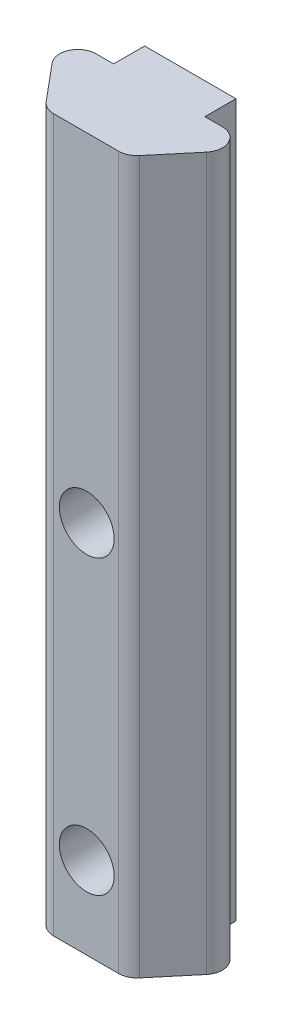
ISO-10303-21;
HEADER;
FILE_DESCRIPTION(('STEP AP214'),'2;1');
FILE_NAME('part.step','',(''),(''),'','','');
FILE_SCHEMA(('AUTOMOTIVE_DESIGN { 1 0 10303 214 1 1 1 1 }'));
ENDSEC;
DATA;
#1=APPLICATION_CONTEXT('core data for automotive mechanical design processes');
#2=APPLICATION_PROTOCOL_DEFINITION('international standard','automotive_design',2000,#1);
#3=PRODUCT_CONTEXT('',#1,'mechanical');
#4=PRODUCT('Part','Part','',(#3));
#5=PRODUCT_RELATED_PRODUCT_CATEGORY('part','',(#4));
#6=PRODUCT_DEFINITION_FORMATION('','',#4);
#7=PRODUCT_DEFINITION_CONTEXT('part definition',#1,'design');
#8=PRODUCT_DEFINITION('design','',#6,#7);
#9=PRODUCT_DEFINITION_SHAPE('','',#8);
#10=(LENGTH_UNIT() NAMED_UNIT(*) SI_UNIT(.MILLI.,.METRE.));
#11=(NAMED_UNIT(*) PLANE_ANGLE_UNIT() SI_UNIT($,.RADIAN.));
#12=(NAMED_UNIT(*) SI_UNIT($,.STERADIAN.) SOLID_ANGLE_UNIT());
#13=UNCERTAINTY_MEASURE_WITH_UNIT(LENGTH_MEASURE(1.E-05),#10,'distance_accuracy_value','');
#14=(GEOMETRIC_REPRESENTATION_CONTEXT(3) GLOBAL_UNCERTAINTY_ASSIGNED_CONTEXT((#13)) GLOBAL_UNIT_ASSIGNED_CONTEXT((#10,
#11,#12)) REPRESENTATION_CONTEXT('',''));
#15=CARTESIAN_POINT('',(0.,0.,0.));
#16=DIRECTION('',(0.,0.,1.));
#17=DIRECTION('',(1.,0.,0.));
#18=AXIS2_PLACEMENT_3D('',#15,#16,#17);
#19=CARTESIAN_POINT('',(-1.53431285488591,49.53,-5.08));
#20=DIRECTION('',(0.,0.,-1.));
#21=DIRECTION('',(-1.,0.,0.));
#22=AXIS2_PLACEMENT_3D('',#19,#20,#21);
#23=PLANE('',#22);
#24=DIRECTION('',(1.,0.,0.));
#25=VECTOR('',#24,1.);
#26=CARTESIAN_POINT('',(-1.53431285488591,0.,-5.08));
#27=LINE('',#26,#25);
#28=CARTESIAN_POINT('',(-1.53431285488591,0.,-5.08));
#29=VERTEX_POINT('',#28);
#30=CARTESIAN_POINT('',(-0.3175,0.,-5.08));
#31=VERTEX_POINT('',#30);
#32=EDGE_CURVE('E158',#29,#31,#27,.T.);
#33=ORIENTED_EDGE('',*,*,#32,.F.);
#34=DIRECTION('',(0.,-1.,0.));
#35=VECTOR('',#34,1.);
#36=CARTESIAN_POINT('',(-1.53431285488591,49.53,-5.08));
#37=LINE('',#36,#35);
#38=CARTESIAN_POINT('',(-1.53431285488591,49.53,-5.08));
#39=VERTEX_POINT('',#38);
#40=EDGE_CURVE('E11',#39,#29,#37,.T.);
#41=ORIENTED_EDGE('',*,*,#40,.F.);
#42=DIRECTION('',(1.,0.,0.));
#43=VECTOR('',#42,1.);
#44=CARTESIAN_POINT('',(-1.53431285488591,49.53,-5.08));
#45=LINE('',#44,#43);
#46=CARTESIAN_POINT('',(-0.3175,49.53,-5.08));
#47=VERTEX_POINT('',#46);
#48=EDGE_CURVE('E187',#39,#47,#45,.T.);
#49=ORIENTED_EDGE('',*,*,#48,.T.);
#50=DIRECTION('',(0.,-1.,0.));
#51=VECTOR('',#50,1.);
#52=CARTESIAN_POINT('',(-0.3175,49.53,-5.08));
#53=LINE('',#52,#51);
#54=EDGE_CURVE('E39',#47,#31,#53,.T.);
#55=ORIENTED_EDGE('',*,*,#54,.T.);
#56=EDGE_LOOP('',(#33,#41,#49,#55));
#57=FACE_BOUND('',#56,.T.);
#58=ADVANCED_FACE('F36',(#57),#23,.T.);
#59=CARTESIAN_POINT('',(-1.53431285488591,49.53,-3.81));
#60=DIRECTION('',(0.,-1.,0.));
#61=DIRECTION('',(0.,0.,-1.));
#62=AXIS2_PLACEMENT_3D('',#59,#60,#61);
#63=CYLINDRICAL_SURFACE('',#62,1.27);
#64=CARTESIAN_POINT('',(-1.53431285488591,0.,-3.81));
#65=DIRECTION('',(0.,1.,0.));
#66=DIRECTION('',(0.,0.,1.));
#67=AXIS2_PLACEMENT_3D('',#64,#65,#66);
#68=CIRCLE('',#67,1.27);
#69=CARTESIAN_POINT('',(-2.50795577239258,0.,-2.99457405658816));
#70=VERTEX_POINT('',#69);
#71=EDGE_CURVE('E93',#29,#70,#68,.T.);
#72=ORIENTED_EDGE('',*,*,#71,.T.);
#73=DIRECTION('',(0.,-1.,0.));
#74=VECTOR('',#73,1.);
#75=CARTESIAN_POINT('',(-2.50795577239258,49.53,-2.99457405658816));
#76=LINE('',#75,#74);
#77=CARTESIAN_POINT('',(-2.50795577239258,49.53,-2.99457405658816));
#78=VERTEX_POINT('',#77);
#79=EDGE_CURVE('E45',#78,#70,#76,.T.);
#80=ORIENTED_EDGE('',*,*,#79,.F.);
#81=CARTESIAN_POINT('',(-1.53431285488591,49.53,-3.81));
#82=DIRECTION('',(0.,1.,0.));
#83=DIRECTION('',(0.,0.,1.));
#84=AXIS2_PLACEMENT_3D('',#81,#82,#83);
#85=CIRCLE('',#84,1.27);
#86=EDGE_CURVE('E136',#39,#78,#85,.T.);
#87=ORIENTED_EDGE('',*,*,#86,.F.);
#88=ORIENTED_EDGE('',*,*,#40,.T.);
#89=EDGE_LOOP('',(#72,#80,#87,#88));
#90=FACE_BOUND('',#89,.T.);
#91=ADVANCED_FACE('F281',(#90),#63,.T.);
#92=CARTESIAN_POINT('',(-2.50795577239258,49.53,-2.99457405658816));
#93=DIRECTION('',(0.766647966540689,0.,-0.642067671977827));
#94=DIRECTION('',(-0.642067671977827,0.,-0.766647966540689));
#95=AXIS2_PLACEMENT_3D('',#92,#93,#94);
#96=PLANE('',#95);
#97=DIRECTION('',(0.642067671977827,0.,0.766647966540689));
#98=VECTOR('',#97,1.);
#99=CARTESIAN_POINT('',(-2.50795577239258,0.,-2.99457405658816));
#100=LINE('',#99,#98);
#101=CARTESIAN_POINT('',(-0.380705772392584,0.,-0.45457405658816));
#102=VERTEX_POINT('',#101);
#103=EDGE_CURVE('E143',#70,#102,#100,.T.);
#104=ORIENTED_EDGE('',*,*,#103,.T.);
#105=DIRECTION('',(0.,-1.,0.));
#106=VECTOR('',#105,1.);
#107=CARTESIAN_POINT('',(-0.380705772392584,49.53,-0.45457405658816));
#108=LINE('',#107,#106);
#109=CARTESIAN_POINT('',(-0.380705772392584,49.53,-0.45457405658816));
#110=VERTEX_POINT('',#109);
#111=EDGE_CURVE('E140',#110,#102,#108,.T.);
#112=ORIENTED_EDGE('',*,*,#111,.F.);
#113=DIRECTION('',(0.642067671977827,0.,0.766647966540689));
#114=VECTOR('',#113,1.);
#115=CARTESIAN_POINT('',(-2.50795577239258,49.53,-2.99457405658816));
#116=LINE('',#115,#114);
#117=EDGE_CURVE('E130',#78,#110,#116,.T.);
#118=ORIENTED_EDGE('',*,*,#117,.F.);
#119=ORIENTED_EDGE('',*,*,#79,.T.);
#120=EDGE_LOOP('',(#104,#112,#118,#119));
#121=FACE_BOUND('',#120,.T.);
#122=ADVANCED_FACE('F141',(#121),#96,.F.);
#123=CARTESIAN_POINT('',(0.592937145114091,49.53,-1.27));
#124=DIRECTION('',(0.,-1.,0.));
#125=DIRECTION('',(0.,0.,-1.));
#126=AXIS2_PLACEMENT_3D('',#123,#124,#125);
#127=CYLINDRICAL_SURFACE('',#126,1.27);
#128=CARTESIAN_POINT('',(0.592937145114091,0.,-1.27));
#129=DIRECTION('',(0.,-1.,0.));
#130=DIRECTION('',(0.,0.,-1.));
#131=AXIS2_PLACEMENT_3D('',#128,#129,#130);
#132=CIRCLE('',#131,1.27);
#133=CARTESIAN_POINT('',(0.592937145114091,0.,0.));
#134=VERTEX_POINT('',#133);
#135=EDGE_CURVE('E184',#134,#102,#132,.T.);
#136=ORIENTED_EDGE('',*,*,#135,.F.);
#137=DIRECTION('',(0.,-1.,0.));
#138=VECTOR('',#137,1.);
#139=CARTESIAN_POINT('',(0.592937145114091,49.53,0.));
#140=LINE('',#139,#138);
#141=CARTESIAN_POINT('',(0.592937145114091,49.53,0.));
#142=VERTEX_POINT('',#141);
#143=EDGE_CURVE('E147',#142,#134,#140,.T.);
#144=ORIENTED_EDGE('',*,*,#143,.F.);
#145=CARTESIAN_POINT('',(0.592937145114091,49.53,-1.27));
#146=DIRECTION('',(0.,-1.,0.));
#147=DIRECTION('',(0.,0.,-1.));
#148=AXIS2_PLACEMENT_3D('',#145,#146,#147);
#149=CIRCLE('',#148,1.27);
#150=EDGE_CURVE('E135',#142,#110,#149,.T.);
#151=ORIENTED_EDGE('',*,*,#150,.T.);
#152=ORIENTED_EDGE('',*,*,#111,.T.);
#153=EDGE_LOOP('',(#136,#144,#151,#152));
#154=FACE_BOUND('',#153,.T.);
#155=ADVANCED_FACE('F149',(#154),#127,.T.);
#156=CARTESIAN_POINT('',(0.592937145114091,49.53,0.));
#157=DIRECTION('',(0.,0.,-1.));
#158=DIRECTION('',(-1.,0.,0.));
#159=AXIS2_PLACEMENT_3D('',#156,#157,#158);
#160=PLANE('',#159);
#161=CARTESIAN_POINT('',(2.897477190706,5.715,0.));
#162=DIRECTION('',(0.,0.,-1.));
#163=DIRECTION('',(-1.,0.,0.));
#164=AXIS2_PLACEMENT_3D('',#161,#162,#163);
#165=CIRCLE('',#164,1.905);
#166=CARTESIAN_POINT('',(0.992477190706002,5.715,0.));
#167=VERTEX_POINT('',#166);
#168=EDGE_CURVE('E162',#167,#167,#165,.F.);
#169=ORIENTED_EDGE('',*,*,#168,.F.);
#170=EDGE_LOOP('',(#169));
#171=FACE_BOUND('',#170,.T.);
#172=CARTESIAN_POINT('',(2.897477190706,26.035,0.));
#173=DIRECTION('',(0.,0.,-1.));
#174=DIRECTION('',(-1.,0.,0.));
#175=AXIS2_PLACEMENT_3D('',#172,#173,#174);
#176=CIRCLE('',#175,1.905);
#177=CARTESIAN_POINT('',(0.992477190706002,26.035,0.));
#178=VERTEX_POINT('',#177);
#179=EDGE_CURVE('E237',#178,#178,#176,.F.);
#180=ORIENTED_EDGE('',*,*,#179,.F.);
#181=EDGE_LOOP('',(#180));
#182=FACE_BOUND('',#181,.T.);
#183=DIRECTION('',(1.,0.,0.));
#184=VECTOR('',#183,1.);
#185=CARTESIAN_POINT('',(0.592937145114091,0.,0.));
#186=LINE('',#185,#184);
#187=CARTESIAN_POINT('',(5.12206285488591,0.,0.));
#188=VERTEX_POINT('',#187);
#189=EDGE_CURVE('E182',#134,#188,#186,.T.);
#190=ORIENTED_EDGE('',*,*,#189,.T.);
#191=DIRECTION('',(0.,-1.,0.));
#192=VECTOR('',#191,1.);
#193=CARTESIAN_POINT('',(5.12206285488591,49.53,0.));
#194=LINE('',#193,#192);
#195=CARTESIAN_POINT('',(5.12206285488591,49.53,0.));
#196=VERTEX_POINT('',#195);
#197=EDGE_CURVE('E191',#196,#188,#194,.T.);
#198=ORIENTED_EDGE('',*,*,#197,.F.);
#199=DIRECTION('',(1.,0.,0.));
#200=VECTOR('',#199,1.);
#201=CARTESIAN_POINT('',(0.592937145114091,49.53,0.));
#202=LINE('',#201,#200);
#203=EDGE_CURVE('E151',#142,#196,#202,.T.);
#204=ORIENTED_EDGE('',*,*,#203,.F.);
#205=ORIENTED_EDGE('',*,*,#143,.T.);
#206=EDGE_LOOP('',(#190,#198,#204,#205));
#207=FACE_BOUND('',#206,.T.);
#208=ADVANCED_FACE('F214',(#171,#182,#207),#160,.F.);
#209=CARTESIAN_POINT('',(5.12206285488591,49.53,-1.27));
#210=DIRECTION('',(0.,-1.,0.));
#211=DIRECTION('',(0.,0.,-1.));
#212=AXIS2_PLACEMENT_3D('',#209,#210,#211);
#213=CYLINDRICAL_SURFACE('',#212,1.27);
#214=CARTESIAN_POINT('',(5.12206285488591,0.,-1.27));
#215=DIRECTION('',(0.,1.,0.));
#216=DIRECTION('',(0.,0.,1.));
#217=AXIS2_PLACEMENT_3D('',#214,#215,#216);
#218=CIRCLE('',#217,1.27);
#219=CARTESIAN_POINT('',(6.09570577239258,0.,-0.45457405658816));
#220=VERTEX_POINT('',#219);
#221=EDGE_CURVE('E180',#188,#220,#218,.T.);
#222=ORIENTED_EDGE('',*,*,#221,.T.);
#223=DIRECTION('',(0.,-1.,0.));
#224=VECTOR('',#223,1.);
#225=CARTESIAN_POINT('',(6.09570577239258,49.53,-0.45457405658816));
#226=LINE('',#225,#224);
#227=CARTESIAN_POINT('',(6.09570577239258,49.53,-0.45457405658816));
#228=VERTEX_POINT('',#227);
#229=EDGE_CURVE('E194',#228,#220,#226,.T.);
#230=ORIENTED_EDGE('',*,*,#229,.F.);
#231=CARTESIAN_POINT('',(5.12206285488591,49.53,-1.27));
#232=DIRECTION('',(0.,1.,0.));
#233=DIRECTION('',(0.,0.,1.));
#234=AXIS2_PLACEMENT_3D('',#231,#232,#233);
#235=CIRCLE('',#234,1.27);
#236=EDGE_CURVE('E153',#196,#228,#235,.T.);
#237=ORIENTED_EDGE('',*,*,#236,.F.);
#238=ORIENTED_EDGE('',*,*,#197,.T.);
#239=EDGE_LOOP('',(#222,#230,#237,#238));
#240=FACE_BOUND('',#239,.T.);
#241=ADVANCED_FACE('F217',(#240),#213,.T.);
#242=CARTESIAN_POINT('',(6.09570577239258,49.53,-0.45457405658816));
#243=DIRECTION('',(-0.766647966540689,0.,-0.642067671977827));
#244=DIRECTION('',(-0.642067671977827,0.,0.766647966540689));
#245=AXIS2_PLACEMENT_3D('',#242,#243,#244);
#246=PLANE('',#245);
#247=DIRECTION('',(0.642067671977827,0.,-0.766647966540689));
#248=VECTOR('',#247,1.);
#249=CARTESIAN_POINT('',(6.09570577239258,0.,-0.45457405658816));
#250=LINE('',#249,#248);
#251=CARTESIAN_POINT('',(8.22295577239258,0.,-2.99457405658816));
#252=VERTEX_POINT('',#251);
#253=EDGE_CURVE('E177',#220,#252,#250,.T.);
#254=ORIENTED_EDGE('',*,*,#253,.T.);
#255=DIRECTION('',(0.,-1.,0.));
#256=VECTOR('',#255,1.);
#257=CARTESIAN_POINT('',(8.22295577239258,49.53,-2.99457405658816));
#258=LINE('',#257,#256);
#259=CARTESIAN_POINT('',(8.22295577239258,49.53,-2.99457405658816));
#260=VERTEX_POINT('',#259);
#261=EDGE_CURVE('E197',#260,#252,#258,.T.);
#262=ORIENTED_EDGE('',*,*,#261,.F.);
#263=DIRECTION('',(0.642067671977827,0.,-0.766647966540689));
#264=VECTOR('',#263,1.);
#265=CARTESIAN_POINT('',(6.09570577239258,49.53,-0.45457405658816));
#266=LINE('',#265,#264);
#267=EDGE_CURVE('E220',#228,#260,#266,.T.);
#268=ORIENTED_EDGE('',*,*,#267,.F.);
#269=ORIENTED_EDGE('',*,*,#229,.T.);
#270=EDGE_LOOP('',(#254,#262,#268,#269));
#271=FACE_BOUND('',#270,.T.);
#272=ADVANCED_FACE('F273',(#271),#246,.F.);
#273=CARTESIAN_POINT('',(7.24931285488591,49.53,-3.81));
#274=DIRECTION('',(0.,-1.,0.));
#275=DIRECTION('',(0.,0.,-1.));
#276=AXIS2_PLACEMENT_3D('',#273,#274,#275);
#277=CYLINDRICAL_SURFACE('',#276,1.27);
#278=CARTESIAN_POINT('',(7.24931285488591,0.,-3.81));
#279=DIRECTION('',(0.,-1.,0.));
#280=DIRECTION('',(0.,0.,-1.));
#281=AXIS2_PLACEMENT_3D('',#278,#279,#280);
#282=CIRCLE('',#281,1.27);
#283=CARTESIAN_POINT('',(7.24931285488591,0.,-5.08));
#284=VERTEX_POINT('',#283);
#285=EDGE_CURVE('E174',#284,#252,#282,.T.);
#286=ORIENTED_EDGE('',*,*,#285,.F.);
#287=DIRECTION('',(0.,-1.,0.));
#288=VECTOR('',#287,1.);
#289=CARTESIAN_POINT('',(7.24931285488591,49.53,-5.08));
#290=LINE('',#289,#288);
#291=CARTESIAN_POINT('',(7.24931285488591,49.53,-5.08));
#292=VERTEX_POINT('',#291);
#293=EDGE_CURVE('E199',#292,#284,#290,.T.);
#294=ORIENTED_EDGE('',*,*,#293,.F.);
#295=CARTESIAN_POINT('',(7.24931285488591,49.53,-3.81));
#296=DIRECTION('',(0.,-1.,0.));
#297=DIRECTION('',(0.,0.,-1.));
#298=AXIS2_PLACEMENT_3D('',#295,#296,#297);
#299=CIRCLE('',#298,1.27);
#300=EDGE_CURVE('E221',#292,#260,#299,.T.);
#301=ORIENTED_EDGE('',*,*,#300,.T.);
#302=ORIENTED_EDGE('',*,*,#261,.T.);
#303=EDGE_LOOP('',(#286,#294,#301,#302));
#304=FACE_BOUND('',#303,.T.);
#305=ADVANCED_FACE('F270',(#304),#277,.T.);
#306=CARTESIAN_POINT('',(6.0325,49.53,-5.08));
#307=DIRECTION('',(0.,0.,-1.));
#308=DIRECTION('',(-1.,0.,0.));
#309=AXIS2_PLACEMENT_3D('',#306,#307,#308);
#310=PLANE('',#309);
#311=DIRECTION('',(1.,0.,0.));
#312=VECTOR('',#311,1.);
#313=CARTESIAN_POINT('',(6.0325,0.,-5.08));
#314=LINE('',#313,#312);
#315=CARTESIAN_POINT('',(6.0325,0.,-5.08));
#316=VERTEX_POINT('',#315);
#317=EDGE_CURVE('E171',#316,#284,#314,.T.);
#318=ORIENTED_EDGE('',*,*,#317,.F.);
#319=DIRECTION('',(0.,-1.,0.));
#320=VECTOR('',#319,1.);
#321=CARTESIAN_POINT('',(6.0325,49.53,-5.08));
#322=LINE('',#321,#320);
#323=CARTESIAN_POINT('',(6.0325,49.53,-5.08));
#324=VERTEX_POINT('',#323);
#325=EDGE_CURVE('E201',#324,#316,#322,.T.);
#326=ORIENTED_EDGE('',*,*,#325,.F.);
#327=DIRECTION('',(1.,0.,0.));
#328=VECTOR('',#327,1.);
#329=CARTESIAN_POINT('',(6.0325,49.53,-5.08));
#330=LINE('',#329,#328);
#331=EDGE_CURVE('E226',#324,#292,#330,.T.);
#332=ORIENTED_EDGE('',*,*,#331,.T.);
#333=ORIENTED_EDGE('',*,*,#293,.T.);
#334=EDGE_LOOP('',(#318,#326,#332,#333));
#335=FACE_BOUND('',#334,.T.);
#336=ADVANCED_FACE('F264',(#335),#310,.T.);
#337=CARTESIAN_POINT('',(6.0325,49.53,-5.08));
#338=DIRECTION('',(-1.,0.,0.));
#339=DIRECTION('',(0.,0.,1.));
#340=AXIS2_PLACEMENT_3D('',#337,#338,#339);
#341=PLANE('',#340);
#342=DIRECTION('',(0.,0.,-1.));
#343=VECTOR('',#342,1.);
#344=CARTESIAN_POINT('',(6.0325,0.,-5.08));
#345=LINE('',#344,#343);
#346=CARTESIAN_POINT('',(6.0325,0.,-7.239));
#347=VERTEX_POINT('',#346);
#348=EDGE_CURVE('E168',#316,#347,#345,.T.);
#349=ORIENTED_EDGE('',*,*,#348,.T.);
#350=DIRECTION('',(0.,-1.,0.));
#351=VECTOR('',#350,1.);
#352=CARTESIAN_POINT('',(6.0325,49.53,-7.239));
#353=LINE('',#352,#351);
#354=CARTESIAN_POINT('',(6.0325,49.53,-7.239));
#355=VERTEX_POINT('',#354);
#356=EDGE_CURVE('E203',#355,#347,#353,.T.);
#357=ORIENTED_EDGE('',*,*,#356,.F.);
#358=DIRECTION('',(0.,0.,-1.));
#359=VECTOR('',#358,1.);
#360=CARTESIAN_POINT('',(6.0325,49.53,-5.08));
#361=LINE('',#360,#359);
#362=EDGE_CURVE('E229',#324,#355,#361,.T.);
#363=ORIENTED_EDGE('',*,*,#362,.F.);
#364=ORIENTED_EDGE('',*,*,#325,.T.);
#365=EDGE_LOOP('',(#349,#357,#363,#364));
#366=FACE_BOUND('',#365,.T.);
#367=ADVANCED_FACE('F254',(#366),#341,.F.);
#368=CARTESIAN_POINT('',(-0.3175,49.53,-7.239));
#369=DIRECTION('',(0.,0.,-1.));
#370=DIRECTION('',(-1.,0.,0.));
#371=AXIS2_PLACEMENT_3D('',#368,#369,#370);
#372=PLANE('',#371);
#373=CARTESIAN_POINT('',(2.897477190706,5.715,-7.239));
#374=DIRECTION('',(0.,0.,-1.));
#375=DIRECTION('',(-1.,0.,0.));
#376=AXIS2_PLACEMENT_3D('',#373,#374,#375);
#377=CIRCLE('',#376,1.905);
#378=CARTESIAN_POINT('',(0.992477190706002,5.715,-7.239));
#379=VERTEX_POINT('',#378);
#380=EDGE_CURVE('E240',#379,#379,#377,.T.);
#381=ORIENTED_EDGE('',*,*,#380,.F.);
#382=EDGE_LOOP('',(#381));
#383=FACE_BOUND('',#382,.T.);
#384=CARTESIAN_POINT('',(2.897477190706,26.035,-7.239));
#385=DIRECTION('',(0.,0.,-1.));
#386=DIRECTION('',(-1.,0.,0.));
#387=AXIS2_PLACEMENT_3D('',#384,#385,#386);
#388=CIRCLE('',#387,1.905);
#389=CARTESIAN_POINT('',(0.992477190706002,26.035,-7.239));
#390=VERTEX_POINT('',#389);
#391=EDGE_CURVE('E241',#390,#390,#388,.T.);
#392=ORIENTED_EDGE('',*,*,#391,.F.);
#393=EDGE_LOOP('',(#392));
#394=FACE_BOUND('',#393,.T.);
#395=DIRECTION('',(1.,0.,0.));
#396=VECTOR('',#395,1.);
#397=CARTESIAN_POINT('',(-0.3175,0.,-7.239));
#398=LINE('',#397,#396);
#399=CARTESIAN_POINT('',(-0.3175,0.,-7.239));
#400=VERTEX_POINT('',#399);
#401=EDGE_CURVE('E165',#400,#347,#398,.T.);
#402=ORIENTED_EDGE('',*,*,#401,.F.);
#403=DIRECTION('',(0.,-1.,0.));
#404=VECTOR('',#403,1.);
#405=CARTESIAN_POINT('',(-0.3175,49.53,-7.239));
#406=LINE('',#405,#404);
#407=CARTESIAN_POINT('',(-0.3175,49.53,-7.239));
#408=VERTEX_POINT('',#407);
#409=EDGE_CURVE('E204',#408,#400,#406,.T.);
#410=ORIENTED_EDGE('',*,*,#409,.F.);
#411=DIRECTION('',(1.,0.,0.));
#412=VECTOR('',#411,1.);
#413=CARTESIAN_POINT('',(-0.3175,49.53,-7.239));
#414=LINE('',#413,#412);
#415=EDGE_CURVE('E231',#408,#355,#414,.T.);
#416=ORIENTED_EDGE('',*,*,#415,.T.);
#417=ORIENTED_EDGE('',*,*,#356,.T.);
#418=EDGE_LOOP('',(#402,#410,#416,#417));
#419=FACE_BOUND('',#418,.T.);
#420=ADVANCED_FACE('F251',(#383,#394,#419),#372,.T.);
#421=CARTESIAN_POINT('',(-0.3175,49.53,-5.08));
#422=DIRECTION('',(-1.,0.,0.));
#423=DIRECTION('',(0.,0.,1.));
#424=AXIS2_PLACEMENT_3D('',#421,#422,#423);
#425=PLANE('',#424);
#426=DIRECTION('',(0.,0.,-1.));
#427=VECTOR('',#426,1.);
#428=CARTESIAN_POINT('',(-0.3175,0.,-5.08));
#429=LINE('',#428,#427);
#430=EDGE_CURVE('E161',#31,#400,#429,.T.);
#431=ORIENTED_EDGE('',*,*,#430,.F.);
#432=ORIENTED_EDGE('',*,*,#54,.F.);
#433=DIRECTION('',(0.,0.,-1.));
#434=VECTOR('',#433,1.);
#435=CARTESIAN_POINT('',(-0.3175,49.53,-5.08));
#436=LINE('',#435,#434);
#437=EDGE_CURVE('E234',#47,#408,#436,.T.);
#438=ORIENTED_EDGE('',*,*,#437,.T.);
#439=ORIENTED_EDGE('',*,*,#409,.T.);
#440=EDGE_LOOP('',(#431,#432,#438,#439));
#441=FACE_BOUND('',#440,.T.);
#442=ADVANCED_FACE('F206',(#441),#425,.T.);
#443=CARTESIAN_POINT('',(7.24931285488591,49.53,-3.81));
#444=DIRECTION('',(0.,-1.,0.));
#445=DIRECTION('',(0.,0.,-1.));
#446=AXIS2_PLACEMENT_3D('',#443,#444,#445);
#447=PLANE('',#446);
#448=ORIENTED_EDGE('',*,*,#48,.F.);
#449=ORIENTED_EDGE('',*,*,#86,.T.);
#450=ORIENTED_EDGE('',*,*,#117,.T.);
#451=ORIENTED_EDGE('',*,*,#150,.F.);
#452=ORIENTED_EDGE('',*,*,#203,.T.);
#453=ORIENTED_EDGE('',*,*,#236,.T.);
#454=ORIENTED_EDGE('',*,*,#267,.T.);
#455=ORIENTED_EDGE('',*,*,#300,.F.);
#456=ORIENTED_EDGE('',*,*,#331,.F.);
#457=ORIENTED_EDGE('',*,*,#362,.T.);
#458=ORIENTED_EDGE('',*,*,#415,.F.);
#459=ORIENTED_EDGE('',*,*,#437,.F.);
#460=EDGE_LOOP('',(#448,#449,#450,#451,#452,#453,#454,#455,#456,#457,#458,#459));
#461=FACE_BOUND('',#460,.T.);
#462=ADVANCED_FACE('F133',(#461),#447,.F.);
#463=CARTESIAN_POINT('',(7.24931285488591,0.,-3.81));
#464=DIRECTION('',(0.,-1.,0.));
#465=DIRECTION('',(0.,0.,-1.));
#466=AXIS2_PLACEMENT_3D('',#463,#464,#465);
#467=PLANE('',#466);
#468=ORIENTED_EDGE('',*,*,#32,.T.);
#469=ORIENTED_EDGE('',*,*,#430,.T.);
#470=ORIENTED_EDGE('',*,*,#401,.T.);
#471=ORIENTED_EDGE('',*,*,#348,.F.);
#472=ORIENTED_EDGE('',*,*,#317,.T.);
#473=ORIENTED_EDGE('',*,*,#285,.T.);
#474=ORIENTED_EDGE('',*,*,#253,.F.);
#475=ORIENTED_EDGE('',*,*,#221,.F.);
#476=ORIENTED_EDGE('',*,*,#189,.F.);
#477=ORIENTED_EDGE('',*,*,#135,.T.);
#478=ORIENTED_EDGE('',*,*,#103,.F.);
#479=ORIENTED_EDGE('',*,*,#71,.F.);
#480=EDGE_LOOP('',(#468,#469,#470,#471,#472,#473,#474,#475,#476,#477,#478,#479));
#481=FACE_BOUND('',#480,.T.);
#482=ADVANCED_FACE('F208',(#481),#467,.T.);
#483=CARTESIAN_POINT('',(2.897477190706,26.035,5.38815367264149));
#484=DIRECTION('',(0.,0.,-1.));
#485=DIRECTION('',(-1.,0.,0.));
#486=AXIS2_PLACEMENT_3D('',#483,#484,#485);
#487=CYLINDRICAL_SURFACE('',#486,1.905);
#488=ORIENTED_EDGE('',*,*,#179,.T.);
#489=EDGE_LOOP('',(#488));
#490=FACE_BOUND('',#489,.T.);
#491=ORIENTED_EDGE('',*,*,#391,.T.);
#492=EDGE_LOOP('',(#491));
#493=FACE_BOUND('',#492,.T.);
#494=ADVANCED_FACE('F339',(#490,#493),#487,.F.);
#495=CARTESIAN_POINT('',(2.897477190706,5.715,5.38815367264149));
#496=DIRECTION('',(0.,0.,-1.));
#497=DIRECTION('',(-1.,0.,0.));
#498=AXIS2_PLACEMENT_3D('',#495,#496,#497);
#499=CYLINDRICAL_SURFACE('',#498,1.905);
#500=ORIENTED_EDGE('',*,*,#168,.T.);
#501=EDGE_LOOP('',(#500));
#502=FACE_BOUND('',#501,.T.);
#503=ORIENTED_EDGE('',*,*,#380,.T.);
#504=EDGE_LOOP('',(#503));
#505=FACE_BOUND('',#504,.T.);
#506=ADVANCED_FACE('F249',(#502,#505),#499,.F.);
#507=CLOSED_SHELL('',(#58,#91,#122,#155,#208,#241,#272,#305,#336,#367,#420,#442,#462,#482,#494,#506));
#508=MANIFOLD_SOLID_BREP('B2',#507);
#509=ADVANCED_BREP_SHAPE_REPRESENTATION('',(#18,#508),#14);
#510=SHAPE_DEFINITION_REPRESENTATION(#9,#509);
ENDSEC;
END-ISO-10303-21;
